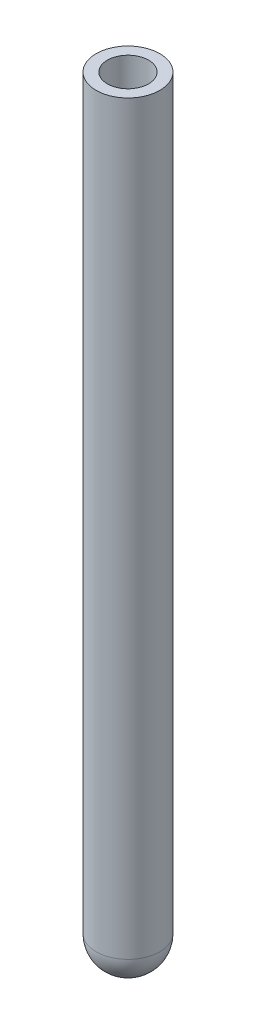
ISO-10303-21;
HEADER;
FILE_DESCRIPTION(('STEP AP214'),'2;1');
FILE_NAME('part.step','',(''),(''),'','','');
FILE_SCHEMA(('AUTOMOTIVE_DESIGN { 1 0 10303 214 1 1 1 1 }'));
ENDSEC;
DATA;
#1=APPLICATION_CONTEXT('core data for automotive mechanical design processes');
#2=APPLICATION_PROTOCOL_DEFINITION('international standard','automotive_design',2000,#1);
#3=PRODUCT_CONTEXT('',#1,'mechanical');
#4=PRODUCT('Part','Part','',(#3));
#5=PRODUCT_RELATED_PRODUCT_CATEGORY('part','',(#4));
#6=PRODUCT_DEFINITION_FORMATION('','',#4);
#7=PRODUCT_DEFINITION_CONTEXT('part definition',#1,'design');
#8=PRODUCT_DEFINITION('design','',#6,#7);
#9=PRODUCT_DEFINITION_SHAPE('','',#8);
#10=(LENGTH_UNIT() NAMED_UNIT(*) SI_UNIT(.MILLI.,.METRE.));
#11=(NAMED_UNIT(*) PLANE_ANGLE_UNIT() SI_UNIT($,.RADIAN.));
#12=(NAMED_UNIT(*) SI_UNIT($,.STERADIAN.) SOLID_ANGLE_UNIT());
#13=UNCERTAINTY_MEASURE_WITH_UNIT(LENGTH_MEASURE(1.E-05),#10,'distance_accuracy_value','');
#14=(GEOMETRIC_REPRESENTATION_CONTEXT(3) GLOBAL_UNCERTAINTY_ASSIGNED_CONTEXT((#13)) GLOBAL_UNIT_ASSIGNED_CONTEXT((#10,
#11,#12)) REPRESENTATION_CONTEXT('',''));
#15=CARTESIAN_POINT('',(0.,0.,0.));
#16=DIRECTION('',(0.,0.,1.));
#17=DIRECTION('',(1.,0.,0.));
#18=AXIS2_PLACEMENT_3D('',#15,#16,#17);
#19=CARTESIAN_POINT('',(0.,0.,-0.51));
#20=DIRECTION('',(0.,-1.,0.));
#21=DIRECTION('',(0.,0.,-1.));
#22=AXIS2_PLACEMENT_3D('',#19,#20,#21);
#23=PLANE('',#22);
#24=CARTESIAN_POINT('',(0.,0.,0.));
#25=DIRECTION('',(0.,1.,0.));
#26=DIRECTION('',(0.,0.,1.));
#27=AXIS2_PLACEMENT_3D('',#24,#25,#26);
#28=CIRCLE('',#27,0.330000000000004);
#29=CARTESIAN_POINT('',(0.,0.,0.330000000000008));
#30=VERTEX_POINT('',#29);
#31=EDGE_CURVE('E44',#30,#30,#28,.T.);
#32=ORIENTED_EDGE('',*,*,#31,.F.);
#33=EDGE_LOOP('',(#32));
#34=FACE_BOUND('',#33,.T.);
#35=CARTESIAN_POINT('',(0.,0.,0.));
#36=DIRECTION('',(0.,1.,0.));
#37=DIRECTION('',(0.,0.,1.));
#38=AXIS2_PLACEMENT_3D('',#35,#36,#37);
#39=CIRCLE('',#38,0.510000000000004);
#40=CARTESIAN_POINT('',(0.,0.,0.510000000000008));
#41=VERTEX_POINT('',#40);
#42=EDGE_CURVE('E53',#41,#41,#39,.T.);
#43=ORIENTED_EDGE('',*,*,#42,.T.);
#44=EDGE_LOOP('',(#43));
#45=FACE_BOUND('',#44,.T.);
#46=ADVANCED_FACE('F33',(#34,#45),#23,.F.);
#47=CARTESIAN_POINT('',(0.,-10.,0.));
#48=DIRECTION('',(0.,1.,0.));
#49=DIRECTION('',(0.,0.,1.));
#50=AXIS2_PLACEMENT_3D('',#47,#48,#49);
#51=CYLINDRICAL_SURFACE('',#50,0.330000000000003);
#52=CARTESIAN_POINT('',(0.,-10.,0.));
#53=DIRECTION('',(0.,1.,0.));
#54=DIRECTION('',(0.,0.,1.));
#55=AXIS2_PLACEMENT_3D('',#52,#53,#54);
#56=CIRCLE('',#55,0.330000000000002);
#57=CARTESIAN_POINT('',(0.,-10.,0.330000000000002));
#58=VERTEX_POINT('',#57);
#59=EDGE_CURVE('E48',#58,#58,#56,.T.);
#60=ORIENTED_EDGE('',*,*,#59,.F.);
#61=EDGE_LOOP('',(#60));
#62=FACE_BOUND('',#61,.T.);
#63=ORIENTED_EDGE('',*,*,#31,.T.);
#64=EDGE_LOOP('',(#63));
#65=FACE_BOUND('',#64,.T.);
#66=ADVANCED_FACE('F70',(#62,#65),#51,.F.);
#67=CARTESIAN_POINT('',(0.,-10.,-0.330000000000001));
#68=DIRECTION('',(0.,-1.,0.));
#69=DIRECTION('',(0.,0.,-1.));
#70=AXIS2_PLACEMENT_3D('',#67,#68,#69);
#71=PLANE('',#70);
#72=ORIENTED_EDGE('',*,*,#59,.T.);
#73=EDGE_LOOP('',(#72));
#74=FACE_BOUND('',#73,.T.);
#75=ADVANCED_FACE('F67',(#74),#71,.F.);
#76=CARTESIAN_POINT('',(0.,-12.45,0.));
#77=DIRECTION('',(0.,1.,0.));
#78=DIRECTION('',(0.,0.,1.));
#79=AXIS2_PLACEMENT_3D('',#76,#77,#78);
#80=PLANE('',#79);
#81=CARTESIAN_POINT('',(0.,-12.45,0.));
#82=DIRECTION('',(0.,1.,0.));
#83=DIRECTION('',(0.,0.,1.));
#84=AXIS2_PLACEMENT_3D('',#81,#82,#83);
#85=CIRCLE('',#84,0.0100000000000019);
#86=CARTESIAN_POINT('',(0.,-12.45,0.0100000000000016));
#87=VERTEX_POINT('',#86);
#88=EDGE_CURVE('E10',#87,#87,#85,.F.);
#89=ORIENTED_EDGE('',*,*,#88,.T.);
#90=EDGE_LOOP('',(#89));
#91=FACE_BOUND('',#90,.T.);
#92=ADVANCED_FACE('F60',(#91),#80,.F.);
#93=CARTESIAN_POINT('',(0.,-10.,0.));
#94=DIRECTION('',(0.,1.,0.));
#95=DIRECTION('',(0.,0.,1.));
#96=AXIS2_PLACEMENT_3D('',#93,#94,#95);
#97=CYLINDRICAL_SURFACE('',#96,0.510000000000002);
#98=CARTESIAN_POINT('',(0.,-11.95,0.));
#99=DIRECTION('',(0.,1.,0.));
#100=DIRECTION('',(0.,0.,1.));
#101=AXIS2_PLACEMENT_3D('',#98,#99,#100);
#102=CIRCLE('',#101,0.510000000000002);
#103=CARTESIAN_POINT('',(0.,-11.95,0.510000000000002));
#104=VERTEX_POINT('',#103);
#105=EDGE_CURVE('E40',#104,#104,#102,.T.);
#106=ORIENTED_EDGE('',*,*,#105,.T.);
#107=EDGE_LOOP('',(#106));
#108=FACE_BOUND('',#107,.T.);
#109=ORIENTED_EDGE('',*,*,#42,.F.);
#110=EDGE_LOOP('',(#109));
#111=FACE_BOUND('',#110,.T.);
#112=ADVANCED_FACE('F58',(#108,#111),#97,.T.);
#113=CARTESIAN_POINT('',(0.,-11.95,0.));
#114=DIRECTION('',(0.,1.,0.));
#115=DIRECTION('',(0.,0.,1.));
#116=AXIS2_PLACEMENT_3D('',#113,#114,#115);
#117=DEGENERATE_TOROIDAL_SURFACE('',#116,0.0100000000000019,0.5,.T.);
#118=ORIENTED_EDGE('',*,*,#88,.F.);
#119=EDGE_LOOP('',(#118));
#120=FACE_BOUND('',#119,.T.);
#121=ORIENTED_EDGE('',*,*,#105,.F.);
#122=EDGE_LOOP('',(#121));
#123=FACE_BOUND('',#122,.T.);
#124=ADVANCED_FACE('F35',(#120,#123),#117,.T.);
#125=CLOSED_SHELL('',(#46,#66,#75,#92,#112,#124));
#126=MANIFOLD_SOLID_BREP('B2',#125);
#127=ADVANCED_BREP_SHAPE_REPRESENTATION('',(#18,#126),#14);
#128=SHAPE_DEFINITION_REPRESENTATION(#9,#127);
ENDSEC;
END-ISO-10303-21;
